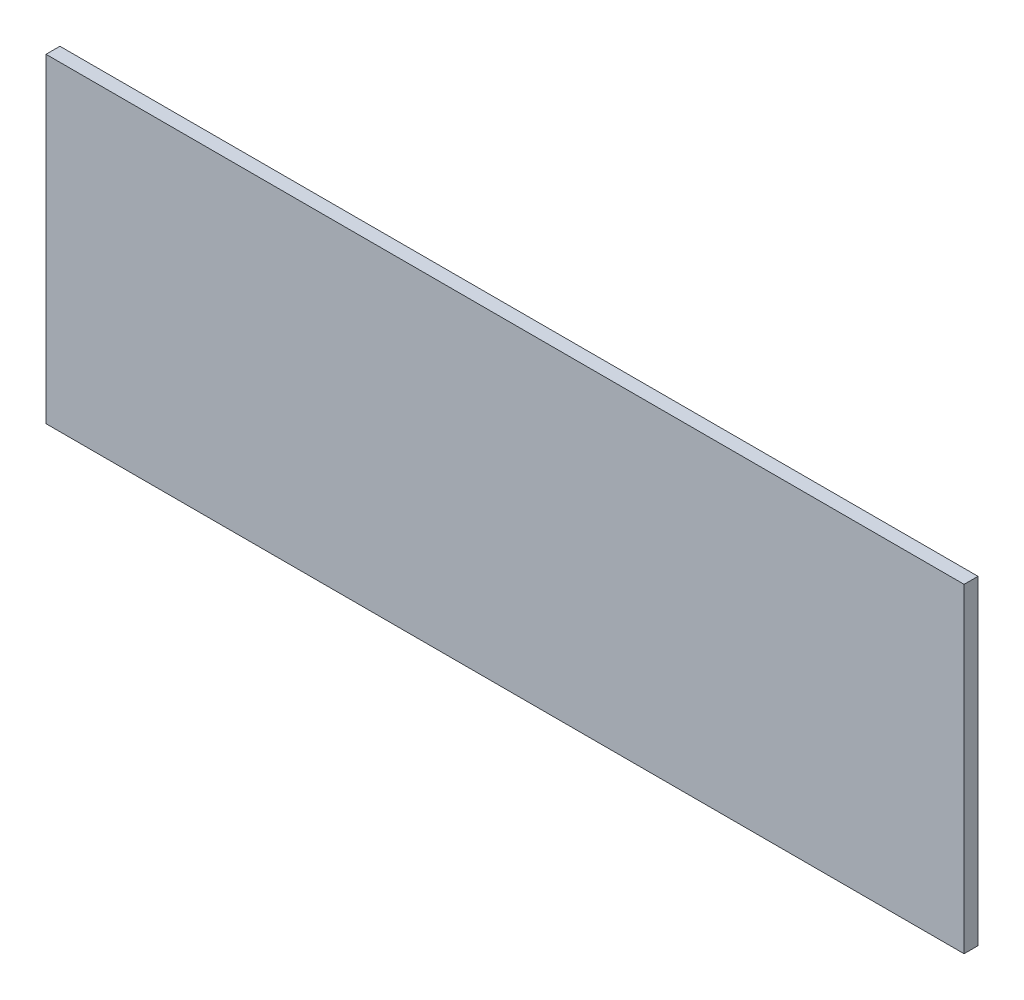
ISO-10303-21;
HEADER;
FILE_DESCRIPTION(('STEP AP214'),'2;1');
FILE_NAME('part.step','',(''),(''),'','','');
FILE_SCHEMA(('AUTOMOTIVE_DESIGN { 1 0 10303 214 1 1 1 1 }'));
ENDSEC;
DATA;
#1=APPLICATION_CONTEXT('core data for automotive mechanical design processes');
#2=APPLICATION_PROTOCOL_DEFINITION('international standard','automotive_design',2000,#1);
#3=PRODUCT_CONTEXT('',#1,'mechanical');
#4=PRODUCT('Part','Part','',(#3));
#5=PRODUCT_RELATED_PRODUCT_CATEGORY('part','',(#4));
#6=PRODUCT_DEFINITION_FORMATION('','',#4);
#7=PRODUCT_DEFINITION_CONTEXT('part definition',#1,'design');
#8=PRODUCT_DEFINITION('design','',#6,#7);
#9=PRODUCT_DEFINITION_SHAPE('','',#8);
#10=(LENGTH_UNIT() NAMED_UNIT(*) SI_UNIT(.MILLI.,.METRE.));
#11=(NAMED_UNIT(*) PLANE_ANGLE_UNIT() SI_UNIT($,.RADIAN.));
#12=(NAMED_UNIT(*) SI_UNIT($,.STERADIAN.) SOLID_ANGLE_UNIT());
#13=UNCERTAINTY_MEASURE_WITH_UNIT(LENGTH_MEASURE(1.E-05),#10,'distance_accuracy_value','');
#14=(GEOMETRIC_REPRESENTATION_CONTEXT(3) GLOBAL_UNCERTAINTY_ASSIGNED_CONTEXT((#13)) GLOBAL_UNIT_ASSIGNED_CONTEXT((#10,
#11,#12)) REPRESENTATION_CONTEXT('',''));
#15=CARTESIAN_POINT('',(0.,0.,0.));
#16=DIRECTION('',(0.,0.,1.));
#17=DIRECTION('',(1.,0.,0.));
#18=AXIS2_PLACEMENT_3D('',#15,#16,#17);
#19=CARTESIAN_POINT('',(330.,115.,10.));
#20=DIRECTION('',(-1.,0.,0.));
#21=DIRECTION('',(0.,0.,1.));
#22=AXIS2_PLACEMENT_3D('',#19,#20,#21);
#23=PLANE('',#22);
#24=DIRECTION('',(0.,1.,0.));
#25=VECTOR('',#24,1.);
#26=CARTESIAN_POINT('',(330.,115.,0.));
#27=LINE('',#26,#25);
#28=CARTESIAN_POINT('',(330.,-115.,0.));
#29=VERTEX_POINT('',#28);
#30=CARTESIAN_POINT('',(330.,115.,0.));
#31=VERTEX_POINT('',#30);
#32=EDGE_CURVE('E98',#29,#31,#27,.T.);
#33=ORIENTED_EDGE('',*,*,#32,.T.);
#34=DIRECTION('',(0.,0.,-1.));
#35=VECTOR('',#34,1.);
#36=CARTESIAN_POINT('',(330.,115.,10.));
#37=LINE('',#36,#35);
#38=CARTESIAN_POINT('',(330.,115.,10.));
#39=VERTEX_POINT('',#38);
#40=EDGE_CURVE('E11',#39,#31,#37,.T.);
#41=ORIENTED_EDGE('',*,*,#40,.F.);
#42=DIRECTION('',(0.,1.,0.));
#43=VECTOR('',#42,1.);
#44=CARTESIAN_POINT('',(330.,115.,10.));
#45=LINE('',#44,#43);
#46=CARTESIAN_POINT('',(330.,-115.,10.));
#47=VERTEX_POINT('',#46);
#48=EDGE_CURVE('E86',#47,#39,#45,.T.);
#49=ORIENTED_EDGE('',*,*,#48,.F.);
#50=DIRECTION('',(0.,0.,-1.));
#51=VECTOR('',#50,1.);
#52=CARTESIAN_POINT('',(330.,-115.,10.));
#53=LINE('',#52,#51);
#54=EDGE_CURVE('E94',#47,#29,#53,.T.);
#55=ORIENTED_EDGE('',*,*,#54,.T.);
#56=EDGE_LOOP('',(#33,#41,#49,#55));
#57=FACE_BOUND('',#56,.T.);
#58=ADVANCED_FACE('F35',(#57),#23,.F.);
#59=CARTESIAN_POINT('',(-330.,115.,10.));
#60=DIRECTION('',(0.,-1.,0.));
#61=DIRECTION('',(0.,0.,-1.));
#62=AXIS2_PLACEMENT_3D('',#59,#60,#61);
#63=PLANE('',#62);
#64=DIRECTION('',(-1.,0.,0.));
#65=VECTOR('',#64,1.);
#66=CARTESIAN_POINT('',(-330.,115.,0.));
#67=LINE('',#66,#65);
#68=CARTESIAN_POINT('',(-330.,115.,0.));
#69=VERTEX_POINT('',#68);
#70=EDGE_CURVE('E90',#31,#69,#67,.T.);
#71=ORIENTED_EDGE('',*,*,#70,.T.);
#72=DIRECTION('',(0.,0.,-1.));
#73=VECTOR('',#72,1.);
#74=CARTESIAN_POINT('',(-330.,115.,10.));
#75=LINE('',#74,#73);
#76=CARTESIAN_POINT('',(-330.,115.,10.));
#77=VERTEX_POINT('',#76);
#78=EDGE_CURVE('E43',#77,#69,#75,.T.);
#79=ORIENTED_EDGE('',*,*,#78,.F.);
#80=DIRECTION('',(-1.,0.,0.));
#81=VECTOR('',#80,1.);
#82=CARTESIAN_POINT('',(-330.,115.,10.));
#83=LINE('',#82,#81);
#84=EDGE_CURVE('E81',#39,#77,#83,.T.);
#85=ORIENTED_EDGE('',*,*,#84,.F.);
#86=ORIENTED_EDGE('',*,*,#40,.T.);
#87=EDGE_LOOP('',(#71,#79,#85,#86));
#88=FACE_BOUND('',#87,.T.);
#89=ADVANCED_FACE('F89',(#88),#63,.F.);
#90=CARTESIAN_POINT('',(-330.,115.,10.));
#91=DIRECTION('',(1.,0.,0.));
#92=DIRECTION('',(0.,1.,0.));
#93=AXIS2_PLACEMENT_3D('',#90,#91,#92);
#94=PLANE('',#93);
#95=DIRECTION('',(0.,-1.,0.));
#96=VECTOR('',#95,1.);
#97=CARTESIAN_POINT('',(-330.,115.,0.));
#98=LINE('',#97,#96);
#99=CARTESIAN_POINT('',(-330.,-115.,0.));
#100=VERTEX_POINT('',#99);
#101=EDGE_CURVE('E68',#69,#100,#98,.T.);
#102=ORIENTED_EDGE('',*,*,#101,.T.);
#103=DIRECTION('',(0.,0.,-1.));
#104=VECTOR('',#103,1.);
#105=CARTESIAN_POINT('',(-330.,-115.,10.));
#106=LINE('',#105,#104);
#107=CARTESIAN_POINT('',(-330.,-115.,10.));
#108=VERTEX_POINT('',#107);
#109=EDGE_CURVE('E91',#108,#100,#106,.T.);
#110=ORIENTED_EDGE('',*,*,#109,.F.);
#111=DIRECTION('',(0.,-1.,0.));
#112=VECTOR('',#111,1.);
#113=CARTESIAN_POINT('',(-330.,115.,10.));
#114=LINE('',#113,#112);
#115=EDGE_CURVE('E84',#77,#108,#114,.T.);
#116=ORIENTED_EDGE('',*,*,#115,.F.);
#117=ORIENTED_EDGE('',*,*,#78,.T.);
#118=EDGE_LOOP('',(#102,#110,#116,#117));
#119=FACE_BOUND('',#118,.T.);
#120=ADVANCED_FACE('F92',(#119),#94,.F.);
#121=CARTESIAN_POINT('',(-330.,-115.,10.));
#122=DIRECTION('',(0.,1.,0.));
#123=DIRECTION('',(0.,0.,1.));
#124=AXIS2_PLACEMENT_3D('',#121,#122,#123);
#125=PLANE('',#124);
#126=DIRECTION('',(1.,0.,0.));
#127=VECTOR('',#126,1.);
#128=CARTESIAN_POINT('',(-330.,-115.,0.));
#129=LINE('',#128,#127);
#130=EDGE_CURVE('E74',#100,#29,#129,.T.);
#131=ORIENTED_EDGE('',*,*,#130,.T.);
#132=ORIENTED_EDGE('',*,*,#54,.F.);
#133=DIRECTION('',(1.,0.,0.));
#134=VECTOR('',#133,1.);
#135=CARTESIAN_POINT('',(-330.,-115.,10.));
#136=LINE('',#135,#134);
#137=EDGE_CURVE('E51',#108,#47,#136,.T.);
#138=ORIENTED_EDGE('',*,*,#137,.F.);
#139=ORIENTED_EDGE('',*,*,#109,.T.);
#140=EDGE_LOOP('',(#131,#132,#138,#139));
#141=FACE_BOUND('',#140,.T.);
#142=ADVANCED_FACE('F105',(#141),#125,.F.);
#143=CARTESIAN_POINT('',(0.,0.,10.));
#144=DIRECTION('',(0.,0.,1.));
#145=DIRECTION('',(1.,0.,0.));
#146=AXIS2_PLACEMENT_3D('',#143,#144,#145);
#147=PLANE('',#146);
#148=ORIENTED_EDGE('',*,*,#48,.T.);
#149=ORIENTED_EDGE('',*,*,#84,.T.);
#150=ORIENTED_EDGE('',*,*,#115,.T.);
#151=ORIENTED_EDGE('',*,*,#137,.T.);
#152=EDGE_LOOP('',(#148,#149,#150,#151));
#153=FACE_BOUND('',#152,.T.);
#154=ADVANCED_FACE('F82',(#153),#147,.T.);
#155=CARTESIAN_POINT('',(0.,0.,0.));
#156=DIRECTION('',(0.,0.,1.));
#157=DIRECTION('',(1.,0.,0.));
#158=AXIS2_PLACEMENT_3D('',#155,#156,#157);
#159=PLANE('',#158);
#160=ORIENTED_EDGE('',*,*,#32,.F.);
#161=ORIENTED_EDGE('',*,*,#130,.F.);
#162=ORIENTED_EDGE('',*,*,#101,.F.);
#163=ORIENTED_EDGE('',*,*,#70,.F.);
#164=EDGE_LOOP('',(#160,#161,#162,#163));
#165=FACE_BOUND('',#164,.T.);
#166=ADVANCED_FACE('F108',(#165),#159,.F.);
#167=CLOSED_SHELL('',(#58,#89,#120,#142,#154,#166));
#168=MANIFOLD_SOLID_BREP('B2',#167);
#169=ADVANCED_BREP_SHAPE_REPRESENTATION('',(#18,#168),#14);
#170=SHAPE_DEFINITION_REPRESENTATION(#9,#169);
ENDSEC;
END-ISO-10303-21;
